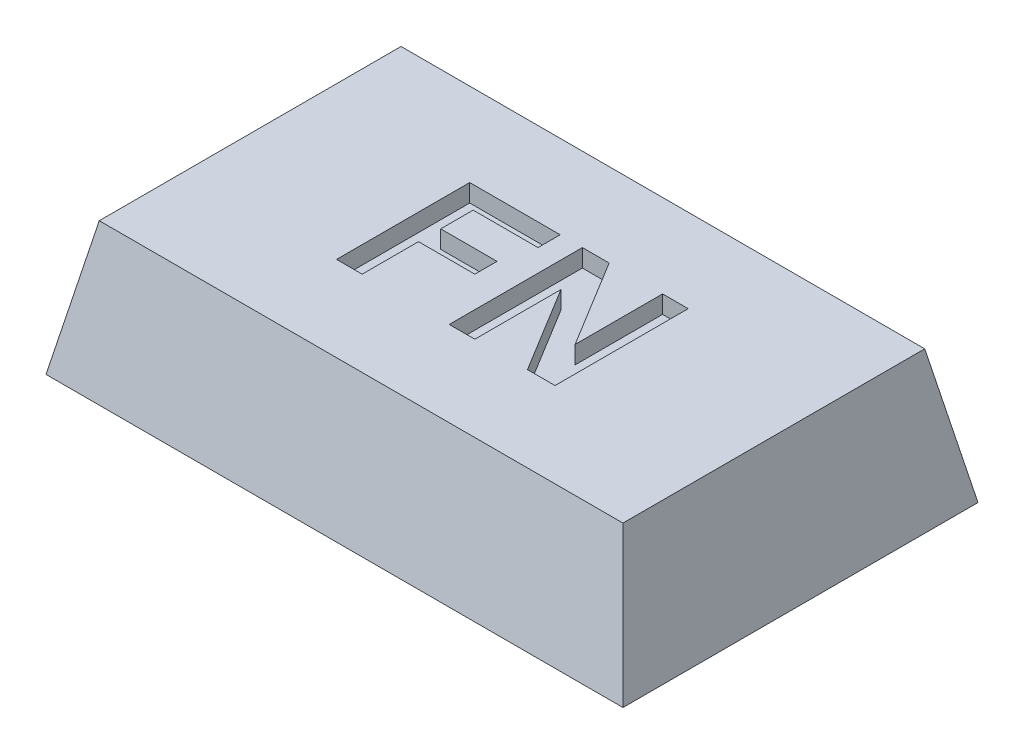
ISO-10303-21;
HEADER;
FILE_DESCRIPTION(('STEP AP214'),'2;1');
FILE_NAME('part.step','',(''),(''),'','','');
FILE_SCHEMA(('AUTOMOTIVE_DESIGN { 1 0 10303 214 1 1 1 1 }'));
ENDSEC;
DATA;
#1=APPLICATION_CONTEXT('core data for automotive mechanical design processes');
#2=APPLICATION_PROTOCOL_DEFINITION('international standard','automotive_design',2000,#1);
#3=PRODUCT_CONTEXT('',#1,'mechanical');
#4=PRODUCT('Part','Part','',(#3));
#5=PRODUCT_RELATED_PRODUCT_CATEGORY('part','',(#4));
#6=PRODUCT_DEFINITION_FORMATION('','',#4);
#7=PRODUCT_DEFINITION_CONTEXT('part definition',#1,'design');
#8=PRODUCT_DEFINITION('design','',#6,#7);
#9=PRODUCT_DEFINITION_SHAPE('','',#8);
#10=(LENGTH_UNIT() NAMED_UNIT(*) SI_UNIT(.MILLI.,.METRE.));
#11=(NAMED_UNIT(*) PLANE_ANGLE_UNIT() SI_UNIT($,.RADIAN.));
#12=(NAMED_UNIT(*) SI_UNIT($,.STERADIAN.) SOLID_ANGLE_UNIT());
#13=UNCERTAINTY_MEASURE_WITH_UNIT(LENGTH_MEASURE(1.E-05),#10,'distance_accuracy_value','');
#14=(GEOMETRIC_REPRESENTATION_CONTEXT(3) GLOBAL_UNCERTAINTY_ASSIGNED_CONTEXT((#13)) GLOBAL_UNIT_ASSIGNED_CONTEXT((#10,
#11,#12)) REPRESENTATION_CONTEXT('',''));
#15=CARTESIAN_POINT('',(0.,0.,0.));
#16=DIRECTION('',(0.,0.,1.));
#17=DIRECTION('',(1.,0.,0.));
#18=AXIS2_PLACEMENT_3D('',#15,#16,#17);
#19=CARTESIAN_POINT('',(0.,3.,0.));
#20=DIRECTION('',(0.,-1.,0.));
#21=DIRECTION('',(0.,0.,-1.));
#22=AXIS2_PLACEMENT_3D('',#19,#20,#21);
#23=PLANE('',#22);
#24=DIRECTION('',(-1.,0.,0.));
#25=VECTOR('',#24,1.);
#26=CARTESIAN_POINT('',(7.14412232211871,3.,-2.5185363973986));
#27=LINE('',#26,#25);
#28=CARTESIAN_POINT('',(7.14412232211871,3.,-2.5185363973986));
#29=VERTEX_POINT('',#28);
#30=CARTESIAN_POINT('',(6.56719924519563,3.,-2.5185363973986));
#31=VERTEX_POINT('',#30);
#32=EDGE_CURVE('E66',#29,#31,#27,.T.);
#33=ORIENTED_EDGE('',*,*,#32,.T.);
#34=DIRECTION('',(0.,0.,-1.));
#35=VECTOR('',#34,1.);
#36=CARTESIAN_POINT('',(6.56719924519563,3.,-2.5185363973986));
#37=LINE('',#36,#35);
#38=CARTESIAN_POINT('',(6.56719924519563,3.,-5.5185363973986));
#39=VERTEX_POINT('',#38);
#40=EDGE_CURVE('E329',#31,#39,#37,.T.);
#41=ORIENTED_EDGE('',*,*,#40,.T.);
#42=DIRECTION('',(1.,0.,0.));
#43=VECTOR('',#42,1.);
#44=CARTESIAN_POINT('',(6.56719924519563,3.,-5.5185363973986));
#45=LINE('',#44,#43);
#46=CARTESIAN_POINT('',(7.16996366827256,3.,-5.5185363973986));
#47=VERTEX_POINT('',#46);
#48=EDGE_CURVE('E325',#39,#47,#45,.T.);
#49=ORIENTED_EDGE('',*,*,#48,.T.);
#50=DIRECTION('',(0.521323795742145,0.,0.853358951434274));
#51=VECTOR('',#50,1.);
#52=CARTESIAN_POINT('',(7.16996366827256,3.,-5.5185363973986));
#53=LINE('',#52,#51);
#54=CARTESIAN_POINT('',(8.37489155288794,3.,-3.54618062816783));
#55=VERTEX_POINT('',#54);
#56=EDGE_CURVE('E321',#47,#55,#53,.T.);
#57=ORIENTED_EDGE('',*,*,#56,.T.);
#58=DIRECTION('',(0.,0.,-1.));
#59=VECTOR('',#58,1.);
#60=CARTESIAN_POINT('',(8.37489155288794,3.,-3.54618062816783));
#61=LINE('',#60,#59);
#62=CARTESIAN_POINT('',(8.37489155288794,3.,-5.5185363973986));
#63=VERTEX_POINT('',#62);
#64=EDGE_CURVE('E317',#55,#63,#61,.T.);
#65=ORIENTED_EDGE('',*,*,#64,.T.);
#66=DIRECTION('',(1.,0.,0.));
#67=VECTOR('',#66,1.);
#68=CARTESIAN_POINT('',(8.37489155288794,3.,-5.5185363973986));
#69=LINE('',#68,#67);
#70=CARTESIAN_POINT('',(8.95181462981102,3.,-5.5185363973986));
#71=VERTEX_POINT('',#70);
#72=EDGE_CURVE('E313',#63,#71,#69,.T.);
#73=ORIENTED_EDGE('',*,*,#72,.T.);
#74=DIRECTION('',(0.,0.,1.));
#75=VECTOR('',#74,1.);
#76=CARTESIAN_POINT('',(8.95181462981102,3.,-5.5185363973986));
#77=LINE('',#76,#75);
#78=CARTESIAN_POINT('',(8.95181462981102,3.,-2.5185363973986));
#79=VERTEX_POINT('',#78);
#80=EDGE_CURVE('E309',#71,#79,#77,.T.);
#81=ORIENTED_EDGE('',*,*,#80,.T.);
#82=DIRECTION('',(-1.,0.,0.));
#83=VECTOR('',#82,1.);
#84=CARTESIAN_POINT('',(8.95181462981102,3.,-2.5185363973986));
#85=LINE('',#84,#83);
#86=CARTESIAN_POINT('',(8.33042039904179,3.,-2.5185363973986));
#87=VERTEX_POINT('',#86);
#88=EDGE_CURVE('E305',#79,#87,#85,.T.);
#89=ORIENTED_EDGE('',*,*,#88,.T.);
#90=DIRECTION('',(-0.521471380338422,0.,-0.853268773299445));
#91=VECTOR('',#90,1.);
#92=CARTESIAN_POINT('',(8.33042039904179,3.,-2.5185363973986));
#93=LINE('',#92,#91);
#94=CARTESIAN_POINT('',(7.14412232211871,3.,-4.45964216662937));
#95=VERTEX_POINT('',#94);
#96=EDGE_CURVE('E300',#87,#95,#93,.T.);
#97=ORIENTED_EDGE('',*,*,#96,.T.);
#98=DIRECTION('',(0.,0.,1.));
#99=VECTOR('',#98,1.);
#100=CARTESIAN_POINT('',(7.14412232211871,3.,-4.45964216662937));
#101=LINE('',#100,#99);
#102=EDGE_CURVE('E296',#95,#29,#101,.T.);
#103=ORIENTED_EDGE('',*,*,#102,.T.);
#104=EDGE_LOOP('',(#33,#41,#49,#57,#65,#73,#81,#89,#97,#103));
#105=FACE_BOUND('',#104,.T.);
#106=DIRECTION('',(-1.,0.,0.));
#107=VECTOR('',#106,1.);
#108=CARTESIAN_POINT('',(13.000055,3.,-0.6));
#109=LINE('',#108,#107);
#110=CARTESIAN_POINT('',(12.4,3.,-0.6));
#111=VERTEX_POINT('',#110);
#112=CARTESIAN_POINT('',(0.6,3.,-0.6));
#113=VERTEX_POINT('',#112);
#114=EDGE_CURVE('E392',#111,#113,#109,.T.);
#115=ORIENTED_EDGE('',*,*,#114,.F.);
#116=DIRECTION('',(0.,0.,1.));
#117=VECTOR('',#116,1.);
#118=CARTESIAN_POINT('',(12.4,3.,-8.));
#119=LINE('',#118,#117);
#120=CARTESIAN_POINT('',(12.4,3.,-7.4));
#121=VERTEX_POINT('',#120);
#122=EDGE_CURVE('E402',#121,#111,#119,.T.);
#123=ORIENTED_EDGE('',*,*,#122,.F.);
#124=DIRECTION('',(-1.,0.,0.));
#125=VECTOR('',#124,1.);
#126=CARTESIAN_POINT('',(13.000055,3.,-7.4));
#127=LINE('',#126,#125);
#128=CARTESIAN_POINT('',(0.599999999999997,3.,-7.4));
#129=VERTEX_POINT('',#128);
#130=EDGE_CURVE('E388',#121,#129,#127,.T.);
#131=ORIENTED_EDGE('',*,*,#130,.T.);
#132=DIRECTION('',(0.,0.,1.));
#133=VECTOR('',#132,1.);
#134=CARTESIAN_POINT('',(0.6,3.,-8.));
#135=LINE('',#134,#133);
#136=EDGE_CURVE('E408',#129,#113,#135,.T.);
#137=ORIENTED_EDGE('',*,*,#136,.T.);
#138=EDGE_LOOP('',(#115,#123,#131,#137));
#139=FACE_BOUND('',#138,.T.);
#140=DIRECTION('',(-1.,0.,0.));
#141=VECTOR('',#140,1.);
#142=CARTESIAN_POINT('',(4.60566078365717,3.,-2.5185363973986));
#143=LINE('',#142,#141);
#144=CARTESIAN_POINT('',(4.60566078365717,3.,-2.5185363973986));
#145=VERTEX_POINT('',#144);
#146=CARTESIAN_POINT('',(4.0287377067341,3.,-2.5185363973986));
#147=VERTEX_POINT('',#146);
#148=EDGE_CURVE('E58',#145,#147,#143,.T.);
#149=ORIENTED_EDGE('',*,*,#148,.T.);
#150=DIRECTION('',(0.,0.,-1.));
#151=VECTOR('',#150,1.);
#152=CARTESIAN_POINT('',(4.0287377067341,3.,-2.5185363973986));
#153=LINE('',#152,#151);
#154=CARTESIAN_POINT('',(4.0287377067341,3.,-5.5185363973986));
#155=VERTEX_POINT('',#154);
#156=EDGE_CURVE('E251',#147,#155,#153,.T.);
#157=ORIENTED_EDGE('',*,*,#156,.T.);
#158=DIRECTION('',(1.,0.,0.));
#159=VECTOR('',#158,1.);
#160=CARTESIAN_POINT('',(4.0287377067341,3.,-5.5185363973986));
#161=LINE('',#160,#159);
#162=CARTESIAN_POINT('',(6.06719924519563,3.,-5.5185363973986));
#163=VERTEX_POINT('',#162);
#164=EDGE_CURVE('E947',#155,#163,#161,.T.);
#165=ORIENTED_EDGE('',*,*,#164,.T.);
#166=DIRECTION('',(0.,0.,1.));
#167=VECTOR('',#166,1.);
#168=CARTESIAN_POINT('',(6.06719924519563,3.,-5.5185363973986));
#169=LINE('',#168,#167);
#170=CARTESIAN_POINT('',(6.06719924519563,3.,-5.0185363973986));
#171=VERTEX_POINT('',#170);
#172=EDGE_CURVE('E949',#163,#171,#169,.T.);
#173=ORIENTED_EDGE('',*,*,#172,.T.);
#174=DIRECTION('',(-1.,0.,0.));
#175=VECTOR('',#174,1.);
#176=CARTESIAN_POINT('',(6.06719924519563,3.,-5.0185363973986));
#177=LINE('',#176,#175);
#178=CARTESIAN_POINT('',(4.60566078365717,3.,-5.0185363973986));
#179=VERTEX_POINT('',#178);
#180=EDGE_CURVE('E954',#171,#179,#177,.T.);
#181=ORIENTED_EDGE('',*,*,#180,.T.);
#182=DIRECTION('',(0.,0.,1.));
#183=VECTOR('',#182,1.);
#184=CARTESIAN_POINT('',(4.60566078365717,3.,-5.0185363973986));
#185=LINE('',#184,#183);
#186=CARTESIAN_POINT('',(4.60566078365717,3.,-4.28776716662937));
#187=VERTEX_POINT('',#186);
#188=EDGE_CURVE('E964',#179,#187,#185,.T.);
#189=ORIENTED_EDGE('',*,*,#188,.T.);
#190=DIRECTION('',(1.,0.,0.));
#191=VECTOR('',#190,1.);
#192=CARTESIAN_POINT('',(4.60566078365717,3.,-4.28776716662937));
#193=LINE('',#192,#191);
#194=CARTESIAN_POINT('',(5.87489155288794,3.,-4.28776716662937));
#195=VERTEX_POINT('',#194);
#196=EDGE_CURVE('E919',#187,#195,#193,.T.);
#197=ORIENTED_EDGE('',*,*,#196,.T.);
#198=DIRECTION('',(0.,0.,1.));
#199=VECTOR('',#198,1.);
#200=CARTESIAN_POINT('',(5.87489155288794,3.,-4.28776716662937));
#201=LINE('',#200,#199);
#202=CARTESIAN_POINT('',(5.87489155288794,3.,-3.78776716662937));
#203=VERTEX_POINT('',#202);
#204=EDGE_CURVE('E914',#195,#203,#201,.T.);
#205=ORIENTED_EDGE('',*,*,#204,.T.);
#206=DIRECTION('',(-1.,0.,0.));
#207=VECTOR('',#206,1.);
#208=CARTESIAN_POINT('',(5.87489155288794,3.,-3.78776716662937));
#209=LINE('',#208,#207);
#210=CARTESIAN_POINT('',(4.60566078365717,3.,-3.78776716662937));
#211=VERTEX_POINT('',#210);
#212=EDGE_CURVE('E908',#203,#211,#209,.T.);
#213=ORIENTED_EDGE('',*,*,#212,.T.);
#214=DIRECTION('',(0.,0.,1.));
#215=VECTOR('',#214,1.);
#216=CARTESIAN_POINT('',(4.60566078365717,3.,-3.78776716662937));
#217=LINE('',#216,#215);
#218=EDGE_CURVE('E247',#211,#145,#217,.T.);
#219=ORIENTED_EDGE('',*,*,#218,.T.);
#220=EDGE_LOOP('',(#149,#157,#165,#173,#181,#189,#197,#205,#213,#219));
#221=FACE_BOUND('',#220,.T.);
#222=ADVANCED_FACE('F42',(#105,#139,#221),#23,.F.);
#223=CARTESIAN_POINT('',(13.,0.,-8.));
#224=DIRECTION('',(-0.98058067569092,-0.196116135138184,0.));
#225=DIRECTION('',(0.196116135138184,-0.98058067569092,0.));
#226=AXIS2_PLACEMENT_3D('',#223,#224,#225);
#227=PLANE('',#226);
#228=DIRECTION('',(-0.192450089729875,0.962250448649376,-0.192450089729875));
#229=VECTOR('',#228,1.);
#230=CARTESIAN_POINT('',(12.7037037037037,1.48148148148148,-0.296296296296295));
#231=LINE('',#230,#229);
#232=CARTESIAN_POINT('',(13.0000245,0.,0.));
#233=VERTEX_POINT('',#232);
#234=EDGE_CURVE('E399',#233,#111,#231,.T.);
#235=ORIENTED_EDGE('',*,*,#234,.F.);
#236=DIRECTION('',(0.,0.,-1.));
#237=VECTOR('',#236,1.);
#238=CARTESIAN_POINT('',(13.,0.,0.));
#239=LINE('',#238,#237);
#240=CARTESIAN_POINT('',(13.0000025,0.,-8.));
#241=VERTEX_POINT('',#240);
#242=EDGE_CURVE('E428',#233,#241,#239,.T.);
#243=ORIENTED_EDGE('',*,*,#242,.T.);
#244=DIRECTION('',(0.192450089729875,-0.962250448649376,-0.192450089729875));
#245=VECTOR('',#244,1.);
#246=CARTESIAN_POINT('',(13.,0.,-8.));
#247=LINE('',#246,#245);
#248=EDGE_CURVE('E395',#121,#241,#247,.T.);
#249=ORIENTED_EDGE('',*,*,#248,.F.);
#250=ORIENTED_EDGE('',*,*,#122,.T.);
#251=EDGE_LOOP('',(#235,#243,#249,#250));
#252=FACE_BOUND('',#251,.T.);
#253=ADVANCED_FACE('F507',(#252),#227,.F.);
#254=CARTESIAN_POINT('',(0.,0.,-8.));
#255=DIRECTION('',(0.98058067569092,-0.196116135138184,0.));
#256=DIRECTION('',(0.196116135138184,0.98058067569092,0.));
#257=AXIS2_PLACEMENT_3D('',#254,#255,#256);
#258=PLANE('',#257);
#259=DIRECTION('',(-0.192450089729875,-0.962250448649376,0.192450089729875));
#260=VECTOR('',#259,1.);
#261=CARTESIAN_POINT('',(0.296296296296296,1.48148148148148,-0.296296296296295));
#262=LINE('',#261,#260);
#263=CARTESIAN_POINT('',(-2.5E-06,0.,0.));
#264=VERTEX_POINT('',#263);
#265=EDGE_CURVE('E434',#113,#264,#262,.T.);
#266=ORIENTED_EDGE('',*,*,#265,.F.);
#267=ORIENTED_EDGE('',*,*,#136,.F.);
#268=DIRECTION('',(0.192450089729875,0.962250448649376,0.192450089729875));
#269=VECTOR('',#268,1.);
#270=CARTESIAN_POINT('',(0.,0.,-8.));
#271=LINE('',#270,#269);
#272=CARTESIAN_POINT('',(0.,0.,-8.));
#273=VERTEX_POINT('',#272);
#274=EDGE_CURVE('E419',#273,#129,#271,.T.);
#275=ORIENTED_EDGE('',*,*,#274,.F.);
#276=DIRECTION('',(0.,0.,1.));
#277=VECTOR('',#276,1.);
#278=CARTESIAN_POINT('',(0.,0.,0.));
#279=LINE('',#278,#277);
#280=EDGE_CURVE('E459',#273,#264,#279,.T.);
#281=ORIENTED_EDGE('',*,*,#280,.T.);
#282=EDGE_LOOP('',(#266,#267,#275,#281));
#283=FACE_BOUND('',#282,.T.);
#284=ADVANCED_FACE('F504',(#283),#258,.F.);
#285=CARTESIAN_POINT('',(0.,0.,0.));
#286=DIRECTION('',(0.,-1.,0.));
#287=DIRECTION('',(0.,0.,-1.));
#288=AXIS2_PLACEMENT_3D('',#285,#286,#287);
#289=PLANE('',#288);
#290=DIRECTION('',(0.,0.,-1.));
#291=VECTOR('',#290,1.);
#292=CARTESIAN_POINT('',(2.500011,0.,-8.));
#293=LINE('',#292,#291);
#294=CARTESIAN_POINT('',(2.500011,0.,-7.));
#295=VERTEX_POINT('',#294);
#296=CARTESIAN_POINT('',(2.500011,0.,-8.));
#297=VERTEX_POINT('',#296);
#298=EDGE_CURVE('E253',#295,#297,#293,.T.);
#299=ORIENTED_EDGE('',*,*,#298,.F.);
#300=DIRECTION('',(-1.,0.,0.));
#301=VECTOR('',#300,1.);
#302=CARTESIAN_POINT('',(2.500011,0.,-7.));
#303=LINE('',#302,#301);
#304=CARTESIAN_POINT('',(10.500011,0.,-7.));
#305=VERTEX_POINT('',#304);
#306=EDGE_CURVE('E369',#305,#295,#303,.T.);
#307=ORIENTED_EDGE('',*,*,#306,.F.);
#308=DIRECTION('',(0.,0.,1.));
#309=VECTOR('',#308,1.);
#310=CARTESIAN_POINT('',(10.500011,0.,-8.));
#311=LINE('',#310,#309);
#312=CARTESIAN_POINT('',(10.500011,0.,-8.));
#313=VERTEX_POINT('',#312);
#314=EDGE_CURVE('E377',#313,#305,#311,.T.);
#315=ORIENTED_EDGE('',*,*,#314,.F.);
#316=DIRECTION('',(-1.,0.,0.));
#317=VECTOR('',#316,1.);
#318=CARTESIAN_POINT('',(0.,0.,-8.));
#319=LINE('',#318,#317);
#320=EDGE_CURVE('E415',#241,#313,#319,.T.);
#321=ORIENTED_EDGE('',*,*,#320,.F.);
#322=ORIENTED_EDGE('',*,*,#242,.F.);
#323=DIRECTION('',(1.,0.,0.));
#324=VECTOR('',#323,1.);
#325=CARTESIAN_POINT('',(0.,0.,0.));
#326=LINE('',#325,#324);
#327=EDGE_CURVE('E475',#264,#233,#326,.T.);
#328=ORIENTED_EDGE('',*,*,#327,.F.);
#329=ORIENTED_EDGE('',*,*,#280,.F.);
#330=EDGE_CURVE('E420',#297,#273,#319,.T.);
#331=ORIENTED_EDGE('',*,*,#330,.F.);
#332=EDGE_LOOP('',(#299,#307,#315,#321,#322,#328,#329,#331));
#333=FACE_BOUND('',#332,.T.);
#334=CARTESIAN_POINT('',(6.50000125,0.,-3.75));
#335=DIRECTION('',(0.,-1.,0.));
#336=DIRECTION('',(0.,0.,-1.));
#337=AXIS2_PLACEMENT_3D('',#334,#335,#336);
#338=CIRCLE('',#337,1.8);
#339=CARTESIAN_POINT('',(6.50000125,0.,-5.55));
#340=VERTEX_POINT('',#339);
#341=EDGE_CURVE('E372',#340,#340,#338,.T.);
#342=ORIENTED_EDGE('',*,*,#341,.F.);
#343=EDGE_LOOP('',(#342));
#344=FACE_BOUND('',#343,.T.);
#345=ADVANCED_FACE('F454',(#333,#344),#289,.T.);
#346=CARTESIAN_POINT('',(13.000055,3.,-7.4));
#347=DIRECTION('',(0.,0.196116135138184,-0.98058067569092));
#348=DIRECTION('',(0.,0.98058067569092,0.196116135138184));
#349=AXIS2_PLACEMENT_3D('',#346,#347,#348);
#350=PLANE('',#349);
#351=ORIENTED_EDGE('',*,*,#248,.T.);
#352=ORIENTED_EDGE('',*,*,#320,.T.);
#353=DIRECTION('',(1.,0.,0.));
#354=VECTOR('',#353,1.);
#355=CARTESIAN_POINT('',(2.500011,0.,-8.));
#356=LINE('',#355,#354);
#357=EDGE_CURVE('E259',#297,#313,#356,.T.);
#358=ORIENTED_EDGE('',*,*,#357,.F.);
#359=ORIENTED_EDGE('',*,*,#330,.T.);
#360=ORIENTED_EDGE('',*,*,#274,.T.);
#361=ORIENTED_EDGE('',*,*,#130,.F.);
#362=EDGE_LOOP('',(#351,#352,#358,#359,#360,#361));
#363=FACE_BOUND('',#362,.T.);
#364=ADVANCED_FACE('F462',(#363),#350,.T.);
#365=CARTESIAN_POINT('',(13.000055,0.,0.));
#366=DIRECTION('',(0.,0.196116135138184,0.98058067569092));
#367=DIRECTION('',(0.,-0.98058067569092,0.196116135138184));
#368=AXIS2_PLACEMENT_3D('',#365,#366,#367);
#369=PLANE('',#368);
#370=ORIENTED_EDGE('',*,*,#234,.T.);
#371=ORIENTED_EDGE('',*,*,#114,.T.);
#372=ORIENTED_EDGE('',*,*,#265,.T.);
#373=ORIENTED_EDGE('',*,*,#327,.T.);
#374=EDGE_LOOP('',(#370,#371,#372,#373));
#375=FACE_BOUND('',#374,.T.);
#376=ADVANCED_FACE('F508',(#375),#369,.T.);
#377=CARTESIAN_POINT('',(6.50000125,0.8,-3.75));
#378=DIRECTION('',(0.,-1.,0.));
#379=DIRECTION('',(0.,0.,-1.));
#380=AXIS2_PLACEMENT_3D('',#377,#378,#379);
#381=CYLINDRICAL_SURFACE('',#380,1.8);
#382=CARTESIAN_POINT('',(6.50000125,0.8,-3.75));
#383=DIRECTION('',(0.,-1.,0.));
#384=DIRECTION('',(0.,0.,-1.));
#385=AXIS2_PLACEMENT_3D('',#382,#383,#384);
#386=CIRCLE('',#385,1.8);
#387=CARTESIAN_POINT('',(6.50000125,0.8,-5.55));
#388=VERTEX_POINT('',#387);
#389=EDGE_CURVE('E384',#388,#388,#386,.T.);
#390=ORIENTED_EDGE('',*,*,#389,.F.);
#391=EDGE_LOOP('',(#390));
#392=FACE_BOUND('',#391,.T.);
#393=ORIENTED_EDGE('',*,*,#341,.T.);
#394=EDGE_LOOP('',(#393));
#395=FACE_BOUND('',#394,.T.);
#396=ADVANCED_FACE('F510',(#392,#395),#381,.F.);
#397=CARTESIAN_POINT('',(6.50000125,0.8,-3.75));
#398=DIRECTION('',(0.,-1.,0.));
#399=DIRECTION('',(0.,0.,-1.));
#400=AXIS2_PLACEMENT_3D('',#397,#398,#399);
#401=PLANE('',#400);
#402=ORIENTED_EDGE('',*,*,#389,.T.);
#403=EDGE_LOOP('',(#402));
#404=FACE_BOUND('',#403,.T.);
#405=ADVANCED_FACE('F516',(#404),#401,.T.);
#406=CARTESIAN_POINT('',(2.500011,-2.,-8.));
#407=DIRECTION('',(0.,0.,1.));
#408=DIRECTION('',(1.,0.,0.));
#409=AXIS2_PLACEMENT_3D('',#406,#407,#408);
#410=PLANE('',#409);
#411=ORIENTED_EDGE('',*,*,#357,.T.);
#412=CARTESIAN_POINT('',(7.03590938486225,2.,-8.));
#413=DIRECTION('',(0.,0.,1.));
#414=DIRECTION('',(1.,0.,0.));
#415=AXIS2_PLACEMENT_3D('',#412,#413,#414);
#416=CIRCLE('',#415,4.);
#417=CARTESIAN_POINT('',(7.03590938486225,-2.,-8.));
#418=VERTEX_POINT('',#417);
#419=EDGE_CURVE('E11',#313,#418,#416,.F.);
#420=ORIENTED_EDGE('',*,*,#419,.T.);
#421=DIRECTION('',(1.,0.,0.));
#422=VECTOR('',#421,1.);
#423=CARTESIAN_POINT('',(2.500011,-2.,-8.));
#424=LINE('',#423,#422);
#425=CARTESIAN_POINT('',(5.96411261513776,-2.,-8.));
#426=VERTEX_POINT('',#425);
#427=EDGE_CURVE('E364',#426,#418,#424,.T.);
#428=ORIENTED_EDGE('',*,*,#427,.F.);
#429=CARTESIAN_POINT('',(5.96411261513776,2.,-8.));
#430=DIRECTION('',(0.,0.,1.));
#431=DIRECTION('',(1.,0.,0.));
#432=AXIS2_PLACEMENT_3D('',#429,#430,#431);
#433=CIRCLE('',#432,4.);
#434=EDGE_CURVE('E51',#426,#297,#433,.F.);
#435=ORIENTED_EDGE('',*,*,#434,.T.);
#436=EDGE_LOOP('',(#411,#420,#428,#435));
#437=FACE_BOUND('',#436,.T.);
#438=ADVANCED_FACE('F447',(#437),#410,.F.);
#439=CARTESIAN_POINT('',(2.500011,-2.,-7.));
#440=DIRECTION('',(0.,0.,-1.));
#441=DIRECTION('',(-1.,0.,0.));
#442=AXIS2_PLACEMENT_3D('',#439,#440,#441);
#443=PLANE('',#442);
#444=DIRECTION('',(-1.,0.,0.));
#445=VECTOR('',#444,1.);
#446=CARTESIAN_POINT('',(2.500011,-2.,-7.));
#447=LINE('',#446,#445);
#448=CARTESIAN_POINT('',(7.03590938486224,-2.,-7.));
#449=VERTEX_POINT('',#448);
#450=CARTESIAN_POINT('',(5.96411261513776,-2.,-7.));
#451=VERTEX_POINT('',#450);
#452=EDGE_CURVE('E368',#449,#451,#447,.T.);
#453=ORIENTED_EDGE('',*,*,#452,.F.);
#454=CARTESIAN_POINT('',(7.03590938486224,2.,-7.));
#455=DIRECTION('',(0.,0.,-1.));
#456=DIRECTION('',(-1.,0.,0.));
#457=AXIS2_PLACEMENT_3D('',#454,#455,#456);
#458=CIRCLE('',#457,4.);
#459=EDGE_CURVE('E441',#449,#305,#458,.F.);
#460=ORIENTED_EDGE('',*,*,#459,.T.);
#461=ORIENTED_EDGE('',*,*,#306,.T.);
#462=CARTESIAN_POINT('',(5.96411261513776,2.,-7.));
#463=DIRECTION('',(0.,0.,-1.));
#464=DIRECTION('',(-1.,0.,0.));
#465=AXIS2_PLACEMENT_3D('',#462,#463,#464);
#466=CIRCLE('',#465,4.);
#467=EDGE_CURVE('E438',#295,#451,#466,.F.);
#468=ORIENTED_EDGE('',*,*,#467,.T.);
#469=EDGE_LOOP('',(#453,#460,#461,#468));
#470=FACE_BOUND('',#469,.T.);
#471=ADVANCED_FACE('F467',(#470),#443,.F.);
#472=CARTESIAN_POINT('',(0.,-2.,0.));
#473=DIRECTION('',(0.,1.,0.));
#474=DIRECTION('',(0.,0.,1.));
#475=AXIS2_PLACEMENT_3D('',#472,#473,#474);
#476=PLANE('',#475);
#477=ORIENTED_EDGE('',*,*,#427,.T.);
#478=DIRECTION('',(0.,0.,1.));
#479=VECTOR('',#478,1.);
#480=CARTESIAN_POINT('',(7.03590938486223,-2.,0.));
#481=LINE('',#480,#479);
#482=EDGE_CURVE('E433',#418,#449,#481,.T.);
#483=ORIENTED_EDGE('',*,*,#482,.T.);
#484=ORIENTED_EDGE('',*,*,#452,.T.);
#485=DIRECTION('',(0.,0.,-1.));
#486=VECTOR('',#485,1.);
#487=CARTESIAN_POINT('',(5.96411261513776,-2.,0.));
#488=LINE('',#487,#486);
#489=EDGE_CURVE('E429',#451,#426,#488,.T.);
#490=ORIENTED_EDGE('',*,*,#489,.T.);
#491=EDGE_LOOP('',(#477,#483,#484,#490));
#492=FACE_BOUND('',#491,.T.);
#493=ADVANCED_FACE('F469',(#492),#476,.F.);
#494=CARTESIAN_POINT('',(7.03590938486225,2.,-8.00000000000001));
#495=DIRECTION('',(0.,0.,1.));
#496=DIRECTION('',(1.,0.,0.));
#497=AXIS2_PLACEMENT_3D('',#494,#495,#496);
#498=CYLINDRICAL_SURFACE('',#497,4.);
#499=ORIENTED_EDGE('',*,*,#419,.F.);
#500=ORIENTED_EDGE('',*,*,#314,.T.);
#501=ORIENTED_EDGE('',*,*,#459,.F.);
#502=ORIENTED_EDGE('',*,*,#482,.F.);
#503=EDGE_LOOP('',(#499,#500,#501,#502));
#504=FACE_BOUND('',#503,.T.);
#505=ADVANCED_FACE('F472',(#504),#498,.T.);
#506=CARTESIAN_POINT('',(5.96411261513776,2.,-8.));
#507=DIRECTION('',(0.,0.,-1.));
#508=DIRECTION('',(-1.,0.,0.));
#509=AXIS2_PLACEMENT_3D('',#506,#507,#508);
#510=CYLINDRICAL_SURFACE('',#509,4.);
#511=ORIENTED_EDGE('',*,*,#467,.F.);
#512=ORIENTED_EDGE('',*,*,#298,.T.);
#513=ORIENTED_EDGE('',*,*,#434,.F.);
#514=ORIENTED_EDGE('',*,*,#489,.F.);
#515=EDGE_LOOP('',(#511,#512,#513,#514));
#516=FACE_BOUND('',#515,.T.);
#517=ADVANCED_FACE('F44',(#516),#510,.T.);
#518=CARTESIAN_POINT('',(7.14412232211871,2.6,-2.5185363973986));
#519=DIRECTION('',(0.,0.,-1.));
#520=DIRECTION('',(-1.,0.,0.));
#521=AXIS2_PLACEMENT_3D('',#518,#519,#520);
#522=PLANE('',#521);
#523=ORIENTED_EDGE('',*,*,#32,.F.);
#524=DIRECTION('',(0.,1.,0.));
#525=VECTOR('',#524,1.);
#526=CARTESIAN_POINT('',(7.14412232211871,2.6,-2.5185363973986));
#527=LINE('',#526,#525);
#528=CARTESIAN_POINT('',(7.14412232211871,2.6,-2.5185363973986));
#529=VERTEX_POINT('',#528);
#530=EDGE_CURVE('E292',#529,#29,#527,.T.);
#531=ORIENTED_EDGE('',*,*,#530,.F.);
#532=DIRECTION('',(-1.,0.,0.));
#533=VECTOR('',#532,1.);
#534=CARTESIAN_POINT('',(7.14412232211871,2.6,-2.5185363973986));
#535=LINE('',#534,#533);
#536=CARTESIAN_POINT('',(6.56719924519563,2.6,-2.5185363973986));
#537=VERTEX_POINT('',#536);
#538=EDGE_CURVE('E301',#529,#537,#535,.T.);
#539=ORIENTED_EDGE('',*,*,#538,.T.);
#540=DIRECTION('',(0.,1.,0.));
#541=VECTOR('',#540,1.);
#542=CARTESIAN_POINT('',(6.56719924519563,2.6,-2.5185363973986));
#543=LINE('',#542,#541);
#544=EDGE_CURVE('E265',#537,#31,#543,.T.);
#545=ORIENTED_EDGE('',*,*,#544,.T.);
#546=EDGE_LOOP('',(#523,#531,#539,#545));
#547=FACE_BOUND('',#546,.T.);
#548=ADVANCED_FACE('F537',(#547),#522,.T.);
#549=CARTESIAN_POINT('',(6.56719924519563,2.6,-2.5185363973986));
#550=DIRECTION('',(1.,0.,0.));
#551=DIRECTION('',(0.,0.,-1.));
#552=AXIS2_PLACEMENT_3D('',#549,#550,#551);
#553=PLANE('',#552);
#554=ORIENTED_EDGE('',*,*,#40,.F.);
#555=ORIENTED_EDGE('',*,*,#544,.F.);
#556=DIRECTION('',(0.,0.,-1.));
#557=VECTOR('',#556,1.);
#558=CARTESIAN_POINT('',(6.56719924519563,2.6,-2.5185363973986));
#559=LINE('',#558,#557);
#560=CARTESIAN_POINT('',(6.56719924519563,2.6,-5.5185363973986));
#561=VERTEX_POINT('',#560);
#562=EDGE_CURVE('E358',#537,#561,#559,.T.);
#563=ORIENTED_EDGE('',*,*,#562,.T.);
#564=DIRECTION('',(0.,1.,0.));
#565=VECTOR('',#564,1.);
#566=CARTESIAN_POINT('',(6.56719924519563,2.6,-5.5185363973986));
#567=LINE('',#566,#565);
#568=EDGE_CURVE('E268',#561,#39,#567,.T.);
#569=ORIENTED_EDGE('',*,*,#568,.T.);
#570=EDGE_LOOP('',(#554,#555,#563,#569));
#571=FACE_BOUND('',#570,.T.);
#572=ADVANCED_FACE('F598',(#571),#553,.T.);
#573=CARTESIAN_POINT('',(6.56719924519563,2.6,-5.5185363973986));
#574=DIRECTION('',(0.,0.,1.));
#575=DIRECTION('',(1.,0.,0.));
#576=AXIS2_PLACEMENT_3D('',#573,#574,#575);
#577=PLANE('',#576);
#578=ORIENTED_EDGE('',*,*,#48,.F.);
#579=ORIENTED_EDGE('',*,*,#568,.F.);
#580=DIRECTION('',(1.,0.,0.));
#581=VECTOR('',#580,1.);
#582=CARTESIAN_POINT('',(6.56719924519563,2.6,-5.5185363973986));
#583=LINE('',#582,#581);
#584=CARTESIAN_POINT('',(7.16996366827256,2.6,-5.5185363973986));
#585=VERTEX_POINT('',#584);
#586=EDGE_CURVE('E355',#561,#585,#583,.T.);
#587=ORIENTED_EDGE('',*,*,#586,.T.);
#588=DIRECTION('',(0.,1.,0.));
#589=VECTOR('',#588,1.);
#590=CARTESIAN_POINT('',(7.16996366827256,2.6,-5.5185363973986));
#591=LINE('',#590,#589);
#592=EDGE_CURVE('E271',#585,#47,#591,.T.);
#593=ORIENTED_EDGE('',*,*,#592,.T.);
#594=EDGE_LOOP('',(#578,#579,#587,#593));
#595=FACE_BOUND('',#594,.T.);
#596=ADVANCED_FACE('F604',(#595),#577,.T.);
#597=CARTESIAN_POINT('',(7.16996366827256,2.6,-5.5185363973986));
#598=DIRECTION('',(-0.853358951434273,0.,0.521323795742145));
#599=DIRECTION('',(0.521323795742145,0.,0.853358951434273));
#600=AXIS2_PLACEMENT_3D('',#597,#598,#599);
#601=PLANE('',#600);
#602=ORIENTED_EDGE('',*,*,#56,.F.);
#603=ORIENTED_EDGE('',*,*,#592,.F.);
#604=DIRECTION('',(0.521323795742145,0.,0.853358951434274));
#605=VECTOR('',#604,1.);
#606=CARTESIAN_POINT('',(7.16996366827256,2.6,-5.5185363973986));
#607=LINE('',#606,#605);
#608=CARTESIAN_POINT('',(8.37489155288794,2.6,-3.54618062816783));
#609=VERTEX_POINT('',#608);
#610=EDGE_CURVE('E352',#585,#609,#607,.T.);
#611=ORIENTED_EDGE('',*,*,#610,.T.);
#612=DIRECTION('',(0.,1.,0.));
#613=VECTOR('',#612,1.);
#614=CARTESIAN_POINT('',(8.37489155288794,2.6,-3.54618062816783));
#615=LINE('',#614,#613);
#616=EDGE_CURVE('E274',#609,#55,#615,.T.);
#617=ORIENTED_EDGE('',*,*,#616,.T.);
#618=EDGE_LOOP('',(#602,#603,#611,#617));
#619=FACE_BOUND('',#618,.T.);
#620=ADVANCED_FACE('F612',(#619),#601,.T.);
#621=CARTESIAN_POINT('',(8.37489155288794,2.6,-3.54618062816783));
#622=DIRECTION('',(1.,0.,0.));
#623=DIRECTION('',(0.,0.,-1.));
#624=AXIS2_PLACEMENT_3D('',#621,#622,#623);
#625=PLANE('',#624);
#626=ORIENTED_EDGE('',*,*,#64,.F.);
#627=ORIENTED_EDGE('',*,*,#616,.F.);
#628=DIRECTION('',(0.,0.,-1.));
#629=VECTOR('',#628,1.);
#630=CARTESIAN_POINT('',(8.37489155288794,2.6,-3.54618062816783));
#631=LINE('',#630,#629);
#632=CARTESIAN_POINT('',(8.37489155288794,2.6,-5.5185363973986));
#633=VERTEX_POINT('',#632);
#634=EDGE_CURVE('E349',#609,#633,#631,.T.);
#635=ORIENTED_EDGE('',*,*,#634,.T.);
#636=DIRECTION('',(0.,1.,0.));
#637=VECTOR('',#636,1.);
#638=CARTESIAN_POINT('',(8.37489155288794,2.6,-5.5185363973986));
#639=LINE('',#638,#637);
#640=EDGE_CURVE('E277',#633,#63,#639,.T.);
#641=ORIENTED_EDGE('',*,*,#640,.T.);
#642=EDGE_LOOP('',(#626,#627,#635,#641));
#643=FACE_BOUND('',#642,.T.);
#644=ADVANCED_FACE('F620',(#643),#625,.T.);
#645=CARTESIAN_POINT('',(8.37489155288794,2.6,-5.5185363973986));
#646=DIRECTION('',(0.,0.,1.));
#647=DIRECTION('',(1.,0.,0.));
#648=AXIS2_PLACEMENT_3D('',#645,#646,#647);
#649=PLANE('',#648);
#650=ORIENTED_EDGE('',*,*,#72,.F.);
#651=ORIENTED_EDGE('',*,*,#640,.F.);
#652=DIRECTION('',(1.,0.,0.));
#653=VECTOR('',#652,1.);
#654=CARTESIAN_POINT('',(8.37489155288794,2.6,-5.5185363973986));
#655=LINE('',#654,#653);
#656=CARTESIAN_POINT('',(8.95181462981102,2.6,-5.5185363973986));
#657=VERTEX_POINT('',#656);
#658=EDGE_CURVE('E346',#633,#657,#655,.T.);
#659=ORIENTED_EDGE('',*,*,#658,.T.);
#660=DIRECTION('',(0.,1.,0.));
#661=VECTOR('',#660,1.);
#662=CARTESIAN_POINT('',(8.95181462981102,2.6,-5.5185363973986));
#663=LINE('',#662,#661);
#664=EDGE_CURVE('E280',#657,#71,#663,.T.);
#665=ORIENTED_EDGE('',*,*,#664,.T.);
#666=EDGE_LOOP('',(#650,#651,#659,#665));
#667=FACE_BOUND('',#666,.T.);
#668=ADVANCED_FACE('F628',(#667),#649,.T.);
#669=CARTESIAN_POINT('',(8.95181462981102,2.6,-5.5185363973986));
#670=DIRECTION('',(-1.,0.,0.));
#671=DIRECTION('',(0.,0.,1.));
#672=AXIS2_PLACEMENT_3D('',#669,#670,#671);
#673=PLANE('',#672);
#674=ORIENTED_EDGE('',*,*,#80,.F.);
#675=ORIENTED_EDGE('',*,*,#664,.F.);
#676=DIRECTION('',(0.,0.,1.));
#677=VECTOR('',#676,1.);
#678=CARTESIAN_POINT('',(8.95181462981102,2.6,-5.5185363973986));
#679=LINE('',#678,#677);
#680=CARTESIAN_POINT('',(8.95181462981102,2.6,-2.5185363973986));
#681=VERTEX_POINT('',#680);
#682=EDGE_CURVE('E343',#657,#681,#679,.T.);
#683=ORIENTED_EDGE('',*,*,#682,.T.);
#684=DIRECTION('',(0.,1.,0.));
#685=VECTOR('',#684,1.);
#686=CARTESIAN_POINT('',(8.95181462981102,2.6,-2.5185363973986));
#687=LINE('',#686,#685);
#688=EDGE_CURVE('E283',#681,#79,#687,.T.);
#689=ORIENTED_EDGE('',*,*,#688,.T.);
#690=EDGE_LOOP('',(#674,#675,#683,#689));
#691=FACE_BOUND('',#690,.T.);
#692=ADVANCED_FACE('F636',(#691),#673,.T.);
#693=CARTESIAN_POINT('',(8.95181462981102,2.6,-2.5185363973986));
#694=DIRECTION('',(0.,0.,-1.));
#695=DIRECTION('',(-1.,0.,0.));
#696=AXIS2_PLACEMENT_3D('',#693,#694,#695);
#697=PLANE('',#696);
#698=ORIENTED_EDGE('',*,*,#88,.F.);
#699=ORIENTED_EDGE('',*,*,#688,.F.);
#700=DIRECTION('',(-1.,0.,0.));
#701=VECTOR('',#700,1.);
#702=CARTESIAN_POINT('',(8.95181462981102,2.6,-2.5185363973986));
#703=LINE('',#702,#701);
#704=CARTESIAN_POINT('',(8.33042039904179,2.6,-2.5185363973986));
#705=VERTEX_POINT('',#704);
#706=EDGE_CURVE('E340',#681,#705,#703,.T.);
#707=ORIENTED_EDGE('',*,*,#706,.T.);
#708=DIRECTION('',(0.,1.,0.));
#709=VECTOR('',#708,1.);
#710=CARTESIAN_POINT('',(8.33042039904179,2.6,-2.5185363973986));
#711=LINE('',#710,#709);
#712=EDGE_CURVE('E286',#705,#87,#711,.T.);
#713=ORIENTED_EDGE('',*,*,#712,.T.);
#714=EDGE_LOOP('',(#698,#699,#707,#713));
#715=FACE_BOUND('',#714,.T.);
#716=ADVANCED_FACE('F644',(#715),#697,.T.);
#717=CARTESIAN_POINT('',(8.33042039904179,2.6,-2.5185363973986));
#718=DIRECTION('',(0.853268773299446,0.,-0.521471380338422));
#719=DIRECTION('',(-0.521471380338422,0.,-0.853268773299446));
#720=AXIS2_PLACEMENT_3D('',#717,#718,#719);
#721=PLANE('',#720);
#722=ORIENTED_EDGE('',*,*,#96,.F.);
#723=ORIENTED_EDGE('',*,*,#712,.F.);
#724=DIRECTION('',(-0.521471380338422,0.,-0.853268773299445));
#725=VECTOR('',#724,1.);
#726=CARTESIAN_POINT('',(8.33042039904179,2.6,-2.5185363973986));
#727=LINE('',#726,#725);
#728=CARTESIAN_POINT('',(7.14412232211871,2.6,-4.45964216662937));
#729=VERTEX_POINT('',#728);
#730=EDGE_CURVE('E337',#705,#729,#727,.T.);
#731=ORIENTED_EDGE('',*,*,#730,.T.);
#732=DIRECTION('',(0.,1.,0.));
#733=VECTOR('',#732,1.);
#734=CARTESIAN_POINT('',(7.14412232211871,2.6,-4.45964216662937));
#735=LINE('',#734,#733);
#736=EDGE_CURVE('E289',#729,#95,#735,.T.);
#737=ORIENTED_EDGE('',*,*,#736,.T.);
#738=EDGE_LOOP('',(#722,#723,#731,#737));
#739=FACE_BOUND('',#738,.T.);
#740=ADVANCED_FACE('F652',(#739),#721,.T.);
#741=CARTESIAN_POINT('',(7.14412232211871,2.6,-4.45964216662937));
#742=DIRECTION('',(-1.,0.,0.));
#743=DIRECTION('',(0.,0.,1.));
#744=AXIS2_PLACEMENT_3D('',#741,#742,#743);
#745=PLANE('',#744);
#746=ORIENTED_EDGE('',*,*,#102,.F.);
#747=ORIENTED_EDGE('',*,*,#736,.F.);
#748=DIRECTION('',(0.,0.,1.));
#749=VECTOR('',#748,1.);
#750=CARTESIAN_POINT('',(7.14412232211871,2.6,-4.45964216662937));
#751=LINE('',#750,#749);
#752=EDGE_CURVE('E295',#729,#529,#751,.T.);
#753=ORIENTED_EDGE('',*,*,#752,.T.);
#754=ORIENTED_EDGE('',*,*,#530,.T.);
#755=EDGE_LOOP('',(#746,#747,#753,#754));
#756=FACE_BOUND('',#755,.T.);
#757=ADVANCED_FACE('F660',(#756),#745,.T.);
#758=CARTESIAN_POINT('',(0.,2.6,0.));
#759=DIRECTION('',(0.,-1.,0.));
#760=DIRECTION('',(0.,0.,-1.));
#761=AXIS2_PLACEMENT_3D('',#758,#759,#760);
#762=PLANE('',#761);
#763=ORIENTED_EDGE('',*,*,#538,.F.);
#764=ORIENTED_EDGE('',*,*,#752,.F.);
#765=ORIENTED_EDGE('',*,*,#730,.F.);
#766=ORIENTED_EDGE('',*,*,#706,.F.);
#767=ORIENTED_EDGE('',*,*,#682,.F.);
#768=ORIENTED_EDGE('',*,*,#658,.F.);
#769=ORIENTED_EDGE('',*,*,#634,.F.);
#770=ORIENTED_EDGE('',*,*,#610,.F.);
#771=ORIENTED_EDGE('',*,*,#586,.F.);
#772=ORIENTED_EDGE('',*,*,#562,.F.);
#773=EDGE_LOOP('',(#763,#764,#765,#766,#767,#768,#769,#770,#771,#772));
#774=FACE_BOUND('',#773,.T.);
#775=ADVANCED_FACE('F544',(#774),#762,.F.);
#776=CARTESIAN_POINT('',(4.60566078365717,2.6,-2.5185363973986));
#777=DIRECTION('',(0.,0.,-1.));
#778=DIRECTION('',(-1.,0.,0.));
#779=AXIS2_PLACEMENT_3D('',#776,#777,#778);
#780=PLANE('',#779);
#781=ORIENTED_EDGE('',*,*,#148,.F.);
#782=DIRECTION('',(0.,1.,0.));
#783=VECTOR('',#782,1.);
#784=CARTESIAN_POINT('',(4.60566078365717,2.6,-2.5185363973986));
#785=LINE('',#784,#783);
#786=CARTESIAN_POINT('',(4.60566078365717,2.6,-2.5185363973986));
#787=VERTEX_POINT('',#786);
#788=EDGE_CURVE('E245',#787,#145,#785,.T.);
#789=ORIENTED_EDGE('',*,*,#788,.F.);
#790=DIRECTION('',(-1.,0.,0.));
#791=VECTOR('',#790,1.);
#792=CARTESIAN_POINT('',(4.60566078365717,2.6,-2.5185363973986));
#793=LINE('',#792,#791);
#794=CARTESIAN_POINT('',(4.0287377067341,2.6,-2.5185363973986));
#795=VERTEX_POINT('',#794);
#796=EDGE_CURVE('E235',#787,#795,#793,.T.);
#797=ORIENTED_EDGE('',*,*,#796,.T.);
#798=DIRECTION('',(0.,1.,0.));
#799=VECTOR('',#798,1.);
#800=CARTESIAN_POINT('',(4.0287377067341,2.6,-2.5185363973986));
#801=LINE('',#800,#799);
#802=EDGE_CURVE('E244',#795,#147,#801,.T.);
#803=ORIENTED_EDGE('',*,*,#802,.T.);
#804=EDGE_LOOP('',(#781,#789,#797,#803));
#805=FACE_BOUND('',#804,.T.);
#806=ADVANCED_FACE('F243',(#805),#780,.T.);
#807=CARTESIAN_POINT('',(4.0287377067341,2.6,-2.5185363973986));
#808=DIRECTION('',(1.,0.,0.));
#809=DIRECTION('',(0.,0.,-1.));
#810=AXIS2_PLACEMENT_3D('',#807,#808,#809);
#811=PLANE('',#810);
#812=ORIENTED_EDGE('',*,*,#156,.F.);
#813=ORIENTED_EDGE('',*,*,#802,.F.);
#814=DIRECTION('',(0.,0.,-1.));
#815=VECTOR('',#814,1.);
#816=CARTESIAN_POINT('',(4.0287377067341,2.6,-2.5185363973986));
#817=LINE('',#816,#815);
#818=CARTESIAN_POINT('',(4.0287377067341,2.6,-5.5185363973986));
#819=VERTEX_POINT('',#818);
#820=EDGE_CURVE('E231',#795,#819,#817,.T.);
#821=ORIENTED_EDGE('',*,*,#820,.T.);
#822=DIRECTION('',(0.,1.,0.));
#823=VECTOR('',#822,1.);
#824=CARTESIAN_POINT('',(4.0287377067341,2.6,-5.5185363973986));
#825=LINE('',#824,#823);
#826=EDGE_CURVE('E254',#819,#155,#825,.T.);
#827=ORIENTED_EDGE('',*,*,#826,.T.);
#828=EDGE_LOOP('',(#812,#813,#821,#827));
#829=FACE_BOUND('',#828,.T.);
#830=ADVANCED_FACE('F249',(#829),#811,.T.);
#831=CARTESIAN_POINT('',(4.0287377067341,2.6,-5.5185363973986));
#832=DIRECTION('',(0.,0.,1.));
#833=DIRECTION('',(1.,0.,0.));
#834=AXIS2_PLACEMENT_3D('',#831,#832,#833);
#835=PLANE('',#834);
#836=ORIENTED_EDGE('',*,*,#164,.F.);
#837=ORIENTED_EDGE('',*,*,#826,.F.);
#838=DIRECTION('',(1.,0.,0.));
#839=VECTOR('',#838,1.);
#840=CARTESIAN_POINT('',(4.0287377067341,2.6,-5.5185363973986));
#841=LINE('',#840,#839);
#842=CARTESIAN_POINT('',(6.06719924519563,2.6,-5.5185363973986));
#843=VERTEX_POINT('',#842);
#844=EDGE_CURVE('E237',#819,#843,#841,.T.);
#845=ORIENTED_EDGE('',*,*,#844,.T.);
#846=DIRECTION('',(0.,1.,0.));
#847=VECTOR('',#846,1.);
#848=CARTESIAN_POINT('',(6.06719924519563,2.6,-5.5185363973986));
#849=LINE('',#848,#847);
#850=EDGE_CURVE('E261',#843,#163,#849,.T.);
#851=ORIENTED_EDGE('',*,*,#850,.T.);
#852=EDGE_LOOP('',(#836,#837,#845,#851));
#853=FACE_BOUND('',#852,.T.);
#854=ADVANCED_FACE('F686',(#853),#835,.T.);
#855=CARTESIAN_POINT('',(6.06719924519563,2.6,-5.5185363973986));
#856=DIRECTION('',(-1.,0.,0.));
#857=DIRECTION('',(0.,0.,1.));
#858=AXIS2_PLACEMENT_3D('',#855,#856,#857);
#859=PLANE('',#858);
#860=ORIENTED_EDGE('',*,*,#172,.F.);
#861=ORIENTED_EDGE('',*,*,#850,.F.);
#862=DIRECTION('',(0.,0.,1.));
#863=VECTOR('',#862,1.);
#864=CARTESIAN_POINT('',(6.06719924519563,2.6,-5.5185363973986));
#865=LINE('',#864,#863);
#866=CARTESIAN_POINT('',(6.06719924519563,2.6,-5.0185363973986));
#867=VERTEX_POINT('',#866);
#868=EDGE_CURVE('E994',#843,#867,#865,.T.);
#869=ORIENTED_EDGE('',*,*,#868,.T.);
#870=DIRECTION('',(0.,1.,0.));
#871=VECTOR('',#870,1.);
#872=CARTESIAN_POINT('',(6.06719924519563,2.6,-5.0185363973986));
#873=LINE('',#872,#871);
#874=EDGE_CURVE('E940',#867,#171,#873,.T.);
#875=ORIENTED_EDGE('',*,*,#874,.T.);
#876=EDGE_LOOP('',(#860,#861,#869,#875));
#877=FACE_BOUND('',#876,.T.);
#878=ADVANCED_FACE('F693',(#877),#859,.T.);
#879=CARTESIAN_POINT('',(6.06719924519563,2.6,-5.0185363973986));
#880=DIRECTION('',(0.,0.,-1.));
#881=DIRECTION('',(-1.,0.,0.));
#882=AXIS2_PLACEMENT_3D('',#879,#880,#881);
#883=PLANE('',#882);
#884=ORIENTED_EDGE('',*,*,#180,.F.);
#885=ORIENTED_EDGE('',*,*,#874,.F.);
#886=DIRECTION('',(-1.,0.,0.));
#887=VECTOR('',#886,1.);
#888=CARTESIAN_POINT('',(6.06719924519563,2.6,-5.0185363973986));
#889=LINE('',#888,#887);
#890=CARTESIAN_POINT('',(4.60566078365717,2.6,-5.0185363973986));
#891=VERTEX_POINT('',#890);
#892=EDGE_CURVE('E991',#867,#891,#889,.T.);
#893=ORIENTED_EDGE('',*,*,#892,.T.);
#894=DIRECTION('',(0.,1.,0.));
#895=VECTOR('',#894,1.);
#896=CARTESIAN_POINT('',(4.60566078365717,2.6,-5.0185363973986));
#897=LINE('',#896,#895);
#898=EDGE_CURVE('E937',#891,#179,#897,.T.);
#899=ORIENTED_EDGE('',*,*,#898,.T.);
#900=EDGE_LOOP('',(#884,#885,#893,#899));
#901=FACE_BOUND('',#900,.T.);
#902=ADVANCED_FACE('F701',(#901),#883,.T.);
#903=CARTESIAN_POINT('',(4.60566078365717,2.6,-5.0185363973986));
#904=DIRECTION('',(-1.,0.,0.));
#905=DIRECTION('',(0.,0.,1.));
#906=AXIS2_PLACEMENT_3D('',#903,#904,#905);
#907=PLANE('',#906);
#908=ORIENTED_EDGE('',*,*,#188,.F.);
#909=ORIENTED_EDGE('',*,*,#898,.F.);
#910=DIRECTION('',(0.,0.,1.));
#911=VECTOR('',#910,1.);
#912=CARTESIAN_POINT('',(4.60566078365717,2.6,-5.0185363973986));
#913=LINE('',#912,#911);
#914=CARTESIAN_POINT('',(4.60566078365717,2.6,-4.28776716662937));
#915=VERTEX_POINT('',#914);
#916=EDGE_CURVE('E988',#891,#915,#913,.T.);
#917=ORIENTED_EDGE('',*,*,#916,.T.);
#918=DIRECTION('',(0.,1.,0.));
#919=VECTOR('',#918,1.);
#920=CARTESIAN_POINT('',(4.60566078365717,2.6,-4.28776716662937));
#921=LINE('',#920,#919);
#922=EDGE_CURVE('E934',#915,#187,#921,.T.);
#923=ORIENTED_EDGE('',*,*,#922,.T.);
#924=EDGE_LOOP('',(#908,#909,#917,#923));
#925=FACE_BOUND('',#924,.T.);
#926=ADVANCED_FACE('F709',(#925),#907,.T.);
#927=CARTESIAN_POINT('',(4.60566078365717,2.6,-4.28776716662937));
#928=DIRECTION('',(0.,0.,1.));
#929=DIRECTION('',(1.,0.,0.));
#930=AXIS2_PLACEMENT_3D('',#927,#928,#929);
#931=PLANE('',#930);
#932=ORIENTED_EDGE('',*,*,#196,.F.);
#933=ORIENTED_EDGE('',*,*,#922,.F.);
#934=DIRECTION('',(1.,0.,0.));
#935=VECTOR('',#934,1.);
#936=CARTESIAN_POINT('',(4.60566078365717,2.6,-4.28776716662937));
#937=LINE('',#936,#935);
#938=CARTESIAN_POINT('',(5.87489155288794,2.6,-4.28776716662937));
#939=VERTEX_POINT('',#938);
#940=EDGE_CURVE('E973',#915,#939,#937,.T.);
#941=ORIENTED_EDGE('',*,*,#940,.T.);
#942=DIRECTION('',(0.,1.,0.));
#943=VECTOR('',#942,1.);
#944=CARTESIAN_POINT('',(5.87489155288794,2.6,-4.28776716662937));
#945=LINE('',#944,#943);
#946=EDGE_CURVE('E931',#939,#195,#945,.T.);
#947=ORIENTED_EDGE('',*,*,#946,.T.);
#948=EDGE_LOOP('',(#932,#933,#941,#947));
#949=FACE_BOUND('',#948,.T.);
#950=ADVANCED_FACE('F717',(#949),#931,.T.);
#951=CARTESIAN_POINT('',(5.87489155288794,2.6,-4.28776716662937));
#952=DIRECTION('',(-1.,0.,0.));
#953=DIRECTION('',(0.,0.,1.));
#954=AXIS2_PLACEMENT_3D('',#951,#952,#953);
#955=PLANE('',#954);
#956=ORIENTED_EDGE('',*,*,#204,.F.);
#957=ORIENTED_EDGE('',*,*,#946,.F.);
#958=DIRECTION('',(0.,0.,1.));
#959=VECTOR('',#958,1.);
#960=CARTESIAN_POINT('',(5.87489155288794,2.6,-4.28776716662937));
#961=LINE('',#960,#959);
#962=CARTESIAN_POINT('',(5.87489155288794,2.6,-3.78776716662937));
#963=VERTEX_POINT('',#962);
#964=EDGE_CURVE('E975',#939,#963,#961,.T.);
#965=ORIENTED_EDGE('',*,*,#964,.T.);
#966=DIRECTION('',(0.,1.,0.));
#967=VECTOR('',#966,1.);
#968=CARTESIAN_POINT('',(5.87489155288794,2.6,-3.78776716662937));
#969=LINE('',#968,#967);
#970=EDGE_CURVE('E928',#963,#203,#969,.T.);
#971=ORIENTED_EDGE('',*,*,#970,.T.);
#972=EDGE_LOOP('',(#956,#957,#965,#971));
#973=FACE_BOUND('',#972,.T.);
#974=ADVANCED_FACE('F725',(#973),#955,.T.);
#975=CARTESIAN_POINT('',(5.87489155288794,2.6,-3.78776716662937));
#976=DIRECTION('',(0.,0.,-1.));
#977=DIRECTION('',(-1.,0.,0.));
#978=AXIS2_PLACEMENT_3D('',#975,#976,#977);
#979=PLANE('',#978);
#980=ORIENTED_EDGE('',*,*,#212,.F.);
#981=ORIENTED_EDGE('',*,*,#970,.F.);
#982=DIRECTION('',(-1.,0.,0.));
#983=VECTOR('',#982,1.);
#984=CARTESIAN_POINT('',(5.87489155288794,2.6,-3.78776716662937));
#985=LINE('',#984,#983);
#986=CARTESIAN_POINT('',(4.60566078365717,2.6,-3.78776716662937));
#987=VERTEX_POINT('',#986);
#988=EDGE_CURVE('E977',#963,#987,#985,.T.);
#989=ORIENTED_EDGE('',*,*,#988,.T.);
#990=DIRECTION('',(0.,1.,0.));
#991=VECTOR('',#990,1.);
#992=CARTESIAN_POINT('',(4.60566078365717,2.6,-3.78776716662937));
#993=LINE('',#992,#991);
#994=EDGE_CURVE('E906',#987,#211,#993,.T.);
#995=ORIENTED_EDGE('',*,*,#994,.T.);
#996=EDGE_LOOP('',(#980,#981,#989,#995));
#997=FACE_BOUND('',#996,.T.);
#998=ADVANCED_FACE('F733',(#997),#979,.T.);
#999=CARTESIAN_POINT('',(4.60566078365717,2.6,-3.78776716662937));
#1000=DIRECTION('',(-1.,0.,0.));
#1001=DIRECTION('',(0.,0.,1.));
#1002=AXIS2_PLACEMENT_3D('',#999,#1000,#1001);
#1003=PLANE('',#1002);
#1004=ORIENTED_EDGE('',*,*,#218,.F.);
#1005=ORIENTED_EDGE('',*,*,#994,.F.);
#1006=DIRECTION('',(0.,0.,1.));
#1007=VECTOR('',#1006,1.);
#1008=CARTESIAN_POINT('',(4.60566078365717,2.6,-3.78776716662937));
#1009=LINE('',#1008,#1007);
#1010=EDGE_CURVE('E925',#987,#787,#1009,.T.);
#1011=ORIENTED_EDGE('',*,*,#1010,.T.);
#1012=ORIENTED_EDGE('',*,*,#788,.T.);
#1013=EDGE_LOOP('',(#1004,#1005,#1011,#1012));
#1014=FACE_BOUND('',#1013,.T.);
#1015=ADVANCED_FACE('F741',(#1014),#1003,.T.);
#1016=CARTESIAN_POINT('',(0.,2.6,0.));
#1017=DIRECTION('',(0.,-1.,0.));
#1018=DIRECTION('',(0.,0.,-1.));
#1019=AXIS2_PLACEMENT_3D('',#1016,#1017,#1018);
#1020=PLANE('',#1019);
#1021=ORIENTED_EDGE('',*,*,#796,.F.);
#1022=ORIENTED_EDGE('',*,*,#1010,.F.);
#1023=ORIENTED_EDGE('',*,*,#988,.F.);
#1024=ORIENTED_EDGE('',*,*,#964,.F.);
#1025=ORIENTED_EDGE('',*,*,#940,.F.);
#1026=ORIENTED_EDGE('',*,*,#916,.F.);
#1027=ORIENTED_EDGE('',*,*,#892,.F.);
#1028=ORIENTED_EDGE('',*,*,#868,.F.);
#1029=ORIENTED_EDGE('',*,*,#844,.F.);
#1030=ORIENTED_EDGE('',*,*,#820,.F.);
#1031=EDGE_LOOP('',(#1021,#1022,#1023,#1024,#1025,#1026,#1027,#1028,#1029,#1030));
#1032=FACE_BOUND('',#1031,.T.);
#1033=ADVANCED_FACE('F233',(#1032),#1020,.F.);
#1034=CLOSED_SHELL('',(#222,#253,#284,#345,#364,#376,#396,#405,#438,#471,#493,#505,#517,#548,
#572,#596,#620,#644,#668,#692,#716,#740,#757,#775,#806,#830,#854,#878,#902,#926,#950,#974,#998,
#1015,#1033));
#1035=MANIFOLD_SOLID_BREP('B2',#1034);
#1036=ADVANCED_BREP_SHAPE_REPRESENTATION('',(#18,#1035),#14);
#1037=SHAPE_DEFINITION_REPRESENTATION(#9,#1036);
ENDSEC;
END-ISO-10303-21;
